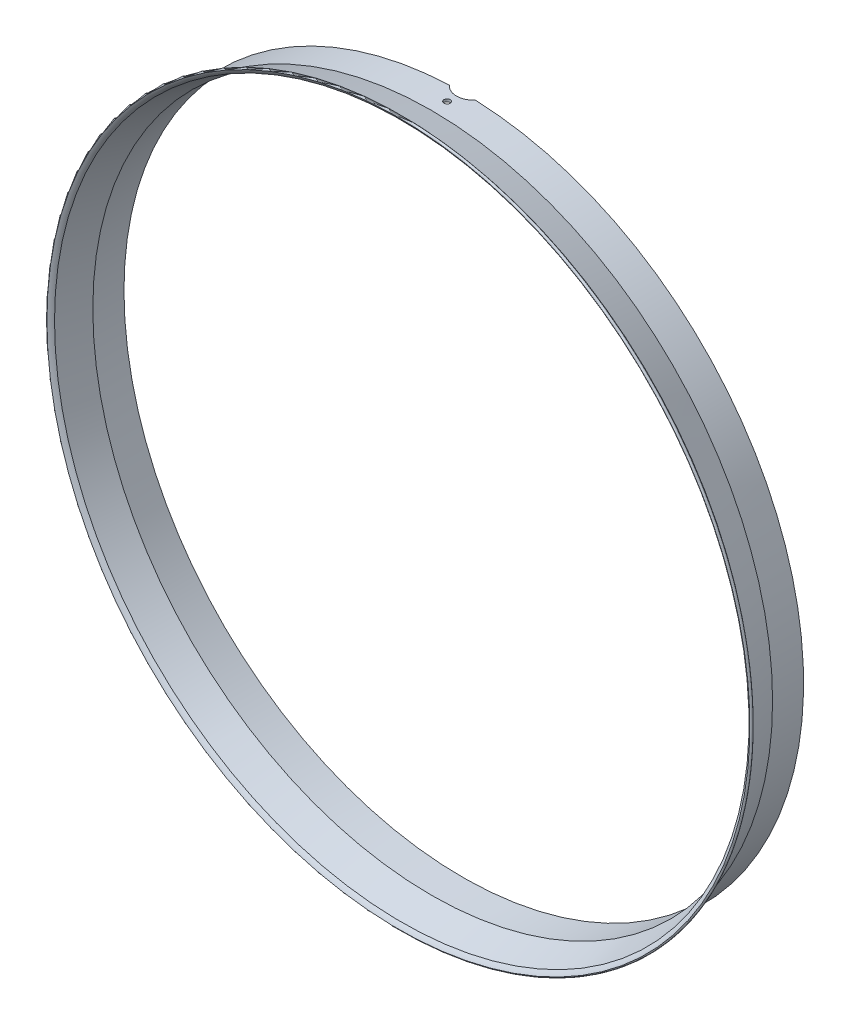
ISO-10303-21;
HEADER;
FILE_DESCRIPTION(('STEP AP214'),'2;1');
FILE_NAME('part.step','',(''),(''),'','','');
FILE_SCHEMA(('AUTOMOTIVE_DESIGN { 1 0 10303 214 1 1 1 1 }'));
ENDSEC;
DATA;
#1=APPLICATION_CONTEXT('core data for automotive mechanical design processes');
#2=APPLICATION_PROTOCOL_DEFINITION('international standard','automotive_design',2000,#1);
#3=PRODUCT_CONTEXT('',#1,'mechanical');
#4=PRODUCT('Part','Part','',(#3));
#5=PRODUCT_RELATED_PRODUCT_CATEGORY('part','',(#4));
#6=PRODUCT_DEFINITION_FORMATION('','',#4);
#7=PRODUCT_DEFINITION_CONTEXT('part definition',#1,'design');
#8=PRODUCT_DEFINITION('design','',#6,#7);
#9=PRODUCT_DEFINITION_SHAPE('','',#8);
#10=(LENGTH_UNIT() NAMED_UNIT(*) SI_UNIT(.MILLI.,.METRE.));
#11=(NAMED_UNIT(*) PLANE_ANGLE_UNIT() SI_UNIT($,.RADIAN.));
#12=(NAMED_UNIT(*) SI_UNIT($,.STERADIAN.) SOLID_ANGLE_UNIT());
#13=UNCERTAINTY_MEASURE_WITH_UNIT(LENGTH_MEASURE(1.E-05),#10,'distance_accuracy_value','');
#14=(GEOMETRIC_REPRESENTATION_CONTEXT(3) GLOBAL_UNCERTAINTY_ASSIGNED_CONTEXT((#13)) GLOBAL_UNIT_ASSIGNED_CONTEXT((#10,
#11,#12)) REPRESENTATION_CONTEXT('',''));
#15=CARTESIAN_POINT('',(0.,0.,0.));
#16=DIRECTION('',(0.,0.,1.));
#17=DIRECTION('',(1.,0.,0.));
#18=AXIS2_PLACEMENT_3D('',#15,#16,#17);
#19=CARTESIAN_POINT('',(-300.,798.285161389459,-417.264314324946));
#20=DIRECTION('',(0.,0.,-1.));
#21=DIRECTION('',(-1.,0.,0.));
#22=AXIS2_PLACEMENT_3D('',#19,#20,#21);
#23=CYLINDRICAL_SURFACE('',#22,163.7);
#24=CARTESIAN_POINT('',(-300.,798.285161389459,-438.785397410857));
#25=DIRECTION('',(0.,0.,-1.));
#26=DIRECTION('',(-1.,0.,0.));
#27=AXIS2_PLACEMENT_3D('',#24,#25,#26);
#28=CIRCLE('',#27,163.7);
#29=CARTESIAN_POINT('',(-463.7,798.285161389459,-438.785397410857));
#30=VERTEX_POINT('',#29);
#31=EDGE_CURVE('E91',#30,#30,#28,.T.);
#32=ORIENTED_EDGE('',*,*,#31,.T.);
#33=EDGE_LOOP('',(#32));
#34=FACE_BOUND('',#33,.T.);
#35=CARTESIAN_POINT('',(-300.,961.985161389459,-447.736353344203));
#36=CARTESIAN_POINT('',(-299.915746239032,961.98516129655,-447.736349608575));
#37=CARTESIAN_POINT('',(-299.831431431172,961.985095644998,-447.729230827914));
#38=CARTESIAN_POINT('',(-299.665124019418,961.984840059218,-447.700931458533));
#39=CARTESIAN_POINT('',(-299.583134332505,961.984649975505,-447.679733956266));
#40=CARTESIAN_POINT('',(-299.42391059771,961.984167058089,-447.623880755037));
#41=CARTESIAN_POINT('',(-299.346674293677,961.983874273581,-447.5892314988));
#42=CARTESIAN_POINT('',(-299.199136683253,961.983219006027,-447.507467240859));
#43=CARTESIAN_POINT('',(-299.128833661293,961.982856540289,-447.460355333586));
#44=CARTESIAN_POINT('',(-298.99712413169,961.982102672716,-447.354992131024));
#45=CARTESIAN_POINT('',(-298.9357187895,961.9817112671,-447.296739378778));
#46=CARTESIAN_POINT('',(-298.823557059873,961.980943668957,-447.170749322985));
#47=CARTESIAN_POINT('',(-298.772801091181,961.980567477029,-447.103011646656));
#48=CARTESIAN_POINT('',(-298.683381792881,961.979872737465,-446.959976300101));
#49=CARTESIAN_POINT('',(-298.644718450615,961.979554189768,-446.88467863779));
#50=CARTESIAN_POINT('',(-298.580582131524,961.979010655276,-446.728660831365));
#51=CARTESIAN_POINT('',(-298.555109125719,961.978785668277,-446.647940699166));
#52=CARTESIAN_POINT('',(-298.518077115924,961.97845462755,-446.483371503866));
#53=CARTESIAN_POINT('',(-298.506517742302,961.978348570665,-446.399522523949));
#54=CARTESIAN_POINT('',(-298.497640011791,961.978267338019,-446.231074118656));
#55=CARTESIAN_POINT('',(-298.500321626332,961.978292161996,-446.146474694787));
#56=CARTESIAN_POINT('',(-298.519849364364,961.978469888733,-445.978929423353));
#57=CARTESIAN_POINT('',(-298.536695067498,961.978622787693,-445.895983526792));
#58=CARTESIAN_POINT('',(-298.584072156505,961.979039420579,-445.734097134469));
#59=CARTESIAN_POINT('',(-298.614603558291,961.979303154635,-445.655156643366));
#60=CARTESIAN_POINT('',(-298.688485831099,961.979911728395,-445.503520685253));
#61=CARTESIAN_POINT('',(-298.731836893774,961.980256569312,-445.430825311628));
#62=CARTESIAN_POINT('',(-298.83012772119,961.98098847757,-445.293744236472));
#63=CARTESIAN_POINT('',(-298.885067484151,961.981375544903,-445.229358533663));
#64=CARTESIAN_POINT('',(-299.004978562779,961.982148284854,-445.11072199999));
#65=CARTESIAN_POINT('',(-299.069950248474,961.98253395742,-445.056471543127));
#66=CARTESIAN_POINT('',(-299.20807952216,961.983260412863,-444.959648381254));
#67=CARTESIAN_POINT('',(-299.281237111242,961.983601195734,-444.917075677799));
#68=CARTESIAN_POINT('',(-299.433661660063,961.984199451954,-444.844816588333));
#69=CARTESIAN_POINT('',(-299.512928624817,961.984456925234,-444.815130212899));
#70=CARTESIAN_POINT('',(-299.675321681688,961.984859533316,-444.76948672013));
#71=CARTESIAN_POINT('',(-299.758447772667,961.985004668152,-444.75352959875));
#72=CARTESIAN_POINT('',(-299.926196144556,961.98516623312,-444.735798042155));
#73=CARTESIAN_POINT('',(-300.010818370931,961.985182667934,-444.734023091064));
#74=CARTESIAN_POINT('',(-300.17915969105,961.985084992371,-444.744704917396));
#75=CARTESIAN_POINT('',(-300.262878784855,961.984970882003,-444.757161693864));
#76=CARTESIAN_POINT('',(-300.427035871471,961.984624983717,-444.795952939649));
#77=CARTESIAN_POINT('',(-300.507473919352,961.984393197775,-444.822287175939));
#78=CARTESIAN_POINT('',(-300.662787198909,961.983838079222,-444.888085550925));
#79=CARTESIAN_POINT('',(-300.737662430198,961.983514746605,-444.927549690538));
#80=CARTESIAN_POINT('',(-300.879726973421,961.982812973603,-445.018488931605));
#81=CARTESIAN_POINT('',(-300.946916063592,961.982434531629,-445.069964379486));
#82=CARTESIAN_POINT('',(-301.071698827272,961.981665210027,-445.183464515947));
#83=CARTESIAN_POINT('',(-301.129292494978,961.981274330393,-445.245489210907));
#84=CARTESIAN_POINT('',(-301.233251203452,961.980524188614,-445.378329359462));
#85=CARTESIAN_POINT('',(-301.279615908568,961.980164927415,-445.44914507574));
#86=CARTESIAN_POINT('',(-301.359798204267,961.97951854172,-445.597555602521));
#87=CARTESIAN_POINT('',(-301.393615809502,961.97923141714,-445.675150405107));
#88=CARTESIAN_POINT('',(-301.44774339544,961.978761682253,-445.834915193123));
#89=CARTESIAN_POINT('',(-301.468053597334,961.978579070233,-445.917085103609));
#90=CARTESIAN_POINT('',(-301.494590581575,961.978338943553,-446.08366875964));
#91=CARTESIAN_POINT('',(-301.500817342062,961.978281429087,-446.168082508669));
#92=CARTESIAN_POINT('',(-301.499010598977,961.978297983068,-446.336753981705));
#93=CARTESIAN_POINT('',(-301.490977644337,961.978372046451,-446.421011711593));
#94=CARTESIAN_POINT('',(-301.460880585984,961.978643395741,-446.586982738755));
#95=CARTESIAN_POINT('',(-301.438816454087,961.978840681897,-446.668696030917));
#96=CARTESIAN_POINT('',(-301.381282983554,961.979336238193,-446.82725997306));
#97=CARTESIAN_POINT('',(-301.345813396291,961.979634510207,-446.904110532822));
#98=CARTESIAN_POINT('',(-301.262477432632,961.980298395489,-447.050763133956));
#99=CARTESIAN_POINT('',(-301.214611539407,961.980664006132,-447.120565449901));
#100=CARTESIAN_POINT('',(-301.10784535244,961.9814213356,-447.251139391607));
#101=CARTESIAN_POINT('',(-301.048945809173,961.981813052648,-447.311911631063));
#102=CARTESIAN_POINT('',(-300.921762815714,961.982578560009,-447.422720678501));
#103=CARTESIAN_POINT('',(-300.853477037622,961.982952345844,-447.472754815393));
#104=CARTESIAN_POINT('',(-300.709446708512,961.983639912984,-447.560668446294));
#105=CARTESIAN_POINT('',(-300.633698494459,961.983953664597,-447.598541931849));
#106=CARTESIAN_POINT('',(-300.476977799739,961.984485172175,-447.660990585028));
#107=CARTESIAN_POINT('',(-300.396011709943,961.984703043106,-447.685581687057));
#108=CARTESIAN_POINT('',(-300.262108366615,961.984959705225,-447.714216915636));
#109=CARTESIAN_POINT('',(-300.21004110252,961.985035010787,-447.722507708423));
#110=CARTESIAN_POINT('',(-300.105323845692,961.985135881946,-447.733577090353));
#111=CARTESIAN_POINT('',(-300.052673852975,961.985161447543,-447.736355679646));
#112=CARTESIAN_POINT('',(-300.,961.985161389459,-447.736353344203));
#113=B_SPLINE_CURVE_WITH_KNOTS('',3,(#35,#36,#37,#38,#39,#40,#41,#42,#43,#44,#45,#46,#47,#48,
#49,#50,#51,#52,#53,#54,#55,#56,#57,#58,#59,#60,#61,#62,#63,#64,#65,#66,#67,#68,#69,#70,#71,#72,
#73,#74,#75,#76,#77,#78,#79,#80,#81,#82,#83,#84,#85,#86,#87,#88,#89,#90,#91,#92,#93,#94,#95,#96,
#97,#98,#99,#100,#101,#102,#103,#104,#105,#106,#107,#108,#109,#110,#111,#112),.UNSPECIFIED.,.T.,
.F.,(4,2,2,2,2,2,2,2,2,2,2,2,2,2,2,2,2,2,2,2,2,2,2,2,2,2,2,2,2,2,2,2,2,2,2,2,2,2,4),(0.,
0.252569022833617,0.505442020986967,0.758194054596072,1.01088338959392,1.26360579297818,
1.51633813182713,1.76907020611721,2.02180172511487,2.27452652986421,2.52725082760481,
2.77996762533772,3.0326847169162,3.28540558677774,3.53812641779074,3.79085657263411,
4.04358676112632,4.2963171570277,4.54904747844556,4.80176860674567,5.05448971808207,
5.30720658589651,5.55992347133885,5.81264764645979,6.06537197442477,6.3181038558041,
6.57083544204778,6.8235628895896,7.07629072942587,7.32900884065147,7.58172745950137,
7.83445076569585,8.08716422299113,8.33986049771636,8.59261955765358,8.84550331178826,
9.0980830126019,9.25598437842631,9.4138857400037),.UNSPECIFIED.);
#114=CARTESIAN_POINT('',(-300.,961.985161389459,-447.736353344203));
#115=VERTEX_POINT('',#114);
#116=EDGE_CURVE('E87',#115,#115,#113,.T.);
#117=ORIENTED_EDGE('',*,*,#116,.T.);
#118=EDGE_LOOP('',(#117));
#119=FACE_BOUND('',#118,.T.);
#120=CARTESIAN_POINT('',(-300.,798.285161389459,-453.670006408865));
#121=DIRECTION('',(0.,0.,-1.));
#122=DIRECTION('',(-1.,0.,0.));
#123=AXIS2_PLACEMENT_3D('',#120,#121,#122);
#124=CIRCLE('',#123,163.7);
#125=CARTESIAN_POINT('',(-293.808705407526,961.868039073125,-453.670006408865));
#126=VERTEX_POINT('',#125);
#127=CARTESIAN_POINT('',(-306.191294592474,961.868039073125,-453.670006408865));
#128=VERTEX_POINT('',#127);
#129=EDGE_CURVE('E84',#126,#128,#124,.T.);
#130=ORIENTED_EDGE('',*,*,#129,.F.);
#131=CARTESIAN_POINT('',(-293.808705407526,961.868039073125,-453.670006408865));
#132=CARTESIAN_POINT('',(-293.951181950129,961.873432031995,-453.495856092082));
#133=CARTESIAN_POINT('',(-294.101037717412,961.878916977127,-453.327751591163));
#134=CARTESIAN_POINT('',(-294.414360592834,961.889914239846,-453.004761021858));
#135=CARTESIAN_POINT('',(-294.577827078942,961.895426556172,-452.84987435005));
#136=CARTESIAN_POINT('',(-294.917126763392,961.906318927281,-452.554526524742));
#137=CARTESIAN_POINT('',(-295.092951822011,961.911699066025,-452.414056023577));
#138=CARTESIAN_POINT('',(-295.455809708453,961.922178193678,-452.148418622291));
#139=CARTESIAN_POINT('',(-295.642842395598,961.927277186114,-452.023251530142));
#140=CARTESIAN_POINT('',(-296.026883970234,961.937051864202,-451.789054681234));
#141=CARTESIAN_POINT('',(-296.223897516728,961.941727349271,-451.680032555754));
#142=CARTESIAN_POINT('',(-296.626423679728,961.950519677028,-451.478971152425));
#143=CARTESIAN_POINT('',(-296.831936425396,961.954636511221,-451.386932132786));
#144=CARTESIAN_POINT('',(-297.249954177638,961.962193781889,-451.220513671002));
#145=CARTESIAN_POINT('',(-297.462457714324,961.965634359505,-451.146130543203));
#146=CARTESIAN_POINT('',(-297.892985652767,961.971742494321,-451.015531318551));
#147=CARTESIAN_POINT('',(-298.11101002564,961.974410055563,-450.959315126678));
#148=CARTESIAN_POINT('',(-298.550861145344,961.978894712268,-450.865487678137));
#149=CARTESIAN_POINT('',(-298.772684874258,961.980712452992,-450.827862304414));
#150=CARTESIAN_POINT('',(-299.218791014881,961.983449349967,-450.771412779533));
#151=CARTESIAN_POINT('',(-299.443074204685,961.984368213033,-450.752594762703));
#152=CARTESIAN_POINT('',(-299.892412153057,961.985280193809,-450.733917205895));
#153=CARTESIAN_POINT('',(-300.117466847343,961.985273386857,-450.734056123069));
#154=CARTESIAN_POINT('',(-300.56676300201,961.984334408863,-450.753287588124));
#155=CARTESIAN_POINT('',(-300.791004462569,961.983402238025,-450.772380131847));
#156=CARTESIAN_POINT('',(-301.236883710133,961.980640195978,-450.829357159674));
#157=CARTESIAN_POINT('',(-301.458523585711,961.978811103672,-450.867225338959));
#158=CARTESIAN_POINT('',(-301.897751098823,961.974308138721,-450.961459480141));
#159=CARTESIAN_POINT('',(-302.115340031874,961.971634541244,-451.017819417019));
#160=CARTESIAN_POINT('',(-302.545104349684,961.965516517792,-451.148670946663));
#161=CARTESIAN_POINT('',(-302.757276957155,961.962071704874,-451.22317164289));
#162=CARTESIAN_POINT('',(-303.174582986803,961.954509701823,-451.389755854513));
#163=CARTESIAN_POINT('',(-303.37971664084,961.950392533863,-451.481838790097));
#164=CARTESIAN_POINT('',(-303.781743724403,961.941596936266,-451.683055853328));
#165=CARTESIAN_POINT('',(-303.978626790521,961.936917827702,-451.792210656022));
#166=CARTESIAN_POINT('',(-304.362486775897,961.927135145479,-452.026711777742));
#167=CARTESIAN_POINT('',(-304.549463924678,961.922031581661,-452.152057721382));
#168=CARTESIAN_POINT('',(-304.911918624329,961.911552565088,-452.417849257392));
#169=CARTESIAN_POINT('',(-305.087412627234,961.90617752177,-452.558272450689));
#170=CARTESIAN_POINT('',(-305.425892921429,961.895302707736,-452.853322909396));
#171=CARTESIAN_POINT('',(-305.588885906224,961.889803005838,-453.007942474714));
#172=CARTESIAN_POINT('',(-305.822950529212,961.881583507103,-453.249479231798));
#173=CARTESIAN_POINT('',(-305.899147592611,961.878852011532,-453.331486386511));
#174=CARTESIAN_POINT('',(-306.047925856804,961.873419285427,-453.498502790316));
#175=CARTESIAN_POINT('',(-306.120512195554,961.870718016389,-453.583507461269));
#176=CARTESIAN_POINT('',(-306.191294592474,961.868039073125,-453.670006408865));
#177=B_SPLINE_CURVE_WITH_KNOTS('',3,(#131,#132,#133,#134,#135,#136,#137,#138,#139,#140,#141,
#142,#143,#144,#145,#146,#147,#148,#149,#150,#151,#152,#153,#154,#155,#156,#157,#158,#159,#160,
#161,#162,#163,#164,#165,#166,#167,#168,#169,#170,#171,#172,#173,#174,#175,#176),.UNSPECIFIED.,
.F.,.F.,(4,2,2,2,2,2,2,2,2,2,2,2,2,2,2,2,2,2,2,2,2,2,4),(0.,0.675007166654227,1.34998350132435,
2.02451936849413,2.69904677069853,3.37389199258843,4.04874747393007,4.72346195560758,
5.39817290820455,6.07237072434966,6.7467883694763,7.42115112575223,8.09551373409425,
8.76929174695911,9.4428504458507,10.1167478515277,10.790623037814,11.4653207382557,
12.1400027989251,12.8136960548688,13.4870260352105,13.822869073856,14.1582196812711),.UNSPECIFIED.);
#178=EDGE_CURVE('E69',#126,#128,#177,.T.);
#179=ORIENTED_EDGE('',*,*,#178,.T.);
#180=EDGE_LOOP('',(#130,#179));
#181=FACE_BOUND('',#180,.T.);
#182=ADVANCED_FACE('F43',(#34,#119,#181),#23,.T.);
#183=CARTESIAN_POINT('',(-300.,635.785161389459,-453.670006408865));
#184=DIRECTION('',(0.,0.,-1.));
#185=DIRECTION('',(-1.,0.,0.));
#186=AXIS2_PLACEMENT_3D('',#183,#184,#185);
#187=PLANE('',#186);
#188=CARTESIAN_POINT('',(-300.,798.285161389459,-453.670006408865));
#189=DIRECTION('',(0.,0.,-1.));
#190=DIRECTION('',(-1.,0.,0.));
#191=AXIS2_PLACEMENT_3D('',#188,#189,#190);
#192=CIRCLE('',#191,162.5);
#193=CARTESIAN_POINT('',(-293.808705407526,960.667173543728,-453.670006408865));
#194=VERTEX_POINT('',#193);
#195=CARTESIAN_POINT('',(-306.191294592474,960.667173543728,-453.670006408865));
#196=VERTEX_POINT('',#195);
#197=EDGE_CURVE('E92',#194,#196,#192,.T.);
#198=ORIENTED_EDGE('',*,*,#197,.F.);
#199=DIRECTION('',(0.,-1.,0.));
#200=VECTOR('',#199,1.);
#201=CARTESIAN_POINT('',(-293.808705407526,967.58739754846,-453.670006408865));
#202=LINE('',#201,#200);
#203=EDGE_CURVE('E65',#126,#194,#202,.T.);
#204=ORIENTED_EDGE('',*,*,#203,.F.);
#205=ORIENTED_EDGE('',*,*,#129,.T.);
#206=DIRECTION('',(0.,-1.,0.));
#207=VECTOR('',#206,1.);
#208=CARTESIAN_POINT('',(-306.191294592474,967.58739754846,-453.670006408865));
#209=LINE('',#208,#207);
#210=EDGE_CURVE('E74',#128,#196,#209,.T.);
#211=ORIENTED_EDGE('',*,*,#210,.T.);
#212=EDGE_LOOP('',(#198,#204,#205,#211));
#213=FACE_BOUND('',#212,.T.);
#214=ADVANCED_FACE('F89',(#213),#187,.T.);
#215=CARTESIAN_POINT('',(-300.,798.285161389459,-417.264314324946));
#216=DIRECTION('',(0.,0.,-1.));
#217=DIRECTION('',(-1.,0.,0.));
#218=AXIS2_PLACEMENT_3D('',#215,#216,#217);
#219=CYLINDRICAL_SURFACE('',#218,162.5);
#220=CARTESIAN_POINT('',(-300.,798.285161389459,-438.713521565126));
#221=DIRECTION('',(0.,0.,-1.));
#222=DIRECTION('',(-1.,0.,0.));
#223=AXIS2_PLACEMENT_3D('',#220,#221,#222);
#224=CIRCLE('',#223,162.5);
#225=CARTESIAN_POINT('',(-462.5,798.285161389459,-438.713521565126));
#226=VERTEX_POINT('',#225);
#227=EDGE_CURVE('E99',#226,#226,#224,.T.);
#228=ORIENTED_EDGE('',*,*,#227,.F.);
#229=EDGE_LOOP('',(#228));
#230=FACE_BOUND('',#229,.T.);
#231=CARTESIAN_POINT('',(-300.,960.785161389459,-447.736353344203));
#232=CARTESIAN_POINT('',(-300.084253732841,960.785161295865,-447.736349608585));
#233=CARTESIAN_POINT('',(-300.168568511886,960.785095159546,-447.729230832658));
#234=CARTESIAN_POINT('',(-300.334875864874,960.784837686536,-447.700931483179));
#235=CARTESIAN_POINT('',(-300.416865521867,960.78464619926,-447.679733996269));
#236=CARTESIAN_POINT('',(-300.576089196671,960.784159716006,-447.623880838235));
#237=CARTESIAN_POINT('',(-300.653325470706,960.783864769589,-447.589231610044));
#238=CARTESIAN_POINT('',(-300.800863027088,960.78320466352,-447.507467420717));
#239=CARTESIAN_POINT('',(-300.871166024959,960.782839521303,-447.46035555393));
#240=CARTESIAN_POINT('',(-301.002875542856,960.78208008686,-447.354992422023));
#241=CARTESIAN_POINT('',(-301.064280893969,960.781685790814,-447.296739695619));
#242=CARTESIAN_POINT('',(-301.176442647896,960.780912524028,-447.170749689962));
#243=CARTESIAN_POINT('',(-301.227198631957,960.780533553892,-447.103012037919));
#244=CARTESIAN_POINT('',(-301.316617979581,960.779833683386,-446.959976715675));
#245=CARTESIAN_POINT('',(-301.355281352651,960.77951278297,-446.884679051419));
#246=CARTESIAN_POINT('',(-301.419417730996,960.778965233955,-446.728661230744));
#247=CARTESIAN_POINT('',(-301.444890765289,960.778738585147,-446.647941086255));
#248=CARTESIAN_POINT('',(-301.481922818509,960.778405099243,-446.483371892511));
#249=CARTESIAN_POINT('',(-301.493482212938,960.778298258913,-446.399522927761));
#250=CARTESIAN_POINT('',(-301.502359989047,960.778216425925,-446.231074548232));
#251=CARTESIAN_POINT('',(-301.499678399338,960.778241433002,-446.146475134963));
#252=CARTESIAN_POINT('',(-301.480150719104,960.77842047177,-445.978929919567));
#253=CARTESIAN_POINT('',(-301.463305055247,960.778574499573,-445.895984067707));
#254=CARTESIAN_POINT('',(-301.415928061586,960.778994208579,-445.734097758178));
#255=CARTESIAN_POINT('',(-301.385396715847,960.779259889911,-445.655157305173));
#256=CARTESIAN_POINT('',(-301.31151456304,960.779872957221,-445.503521395016));
#257=CARTESIAN_POINT('',(-301.268163561415,960.780220344439,-445.430826032663));
#258=CARTESIAN_POINT('',(-301.169872864362,960.780957657197,-445.293744966906));
#259=CARTESIAN_POINT('',(-301.114933170673,960.781347582731,-445.229359262256));
#260=CARTESIAN_POINT('',(-300.995022201166,960.782126029136,-445.110722675083));
#261=CARTESIAN_POINT('',(-300.930050549856,960.782514549954,-445.056472172083));
#262=CARTESIAN_POINT('',(-300.791921333801,960.78324637054,-444.959648911892));
#263=CARTESIAN_POINT('',(-300.718763767965,960.7835896703,-444.917076156255));
#264=CARTESIAN_POINT('',(-300.566339250749,960.784192345195,-444.844816958462));
#265=CARTESIAN_POINT('',(-300.487072294276,960.78445172026,-444.815130527047));
#266=CARTESIAN_POINT('',(-300.324679240131,960.78485730238,-444.769486923404));
#267=CARTESIAN_POINT('',(-300.241553143609,960.785003509468,-444.75352974708));
#268=CARTESIAN_POINT('',(-300.073804794916,960.785166268445,-444.735798089986));
#269=CARTESIAN_POINT('',(-299.989182598087,960.785182825119,-444.734023085693));
#270=CARTESIAN_POINT('',(-299.820841328261,960.785084429319,-444.744704796602));
#271=CARTESIAN_POINT('',(-299.737122255201,960.784969476853,-444.757161510826));
#272=CARTESIAN_POINT('',(-299.572965221877,960.78462102541,-444.795952618554));
#273=CARTESIAN_POINT('',(-299.492527205723,960.784387528453,-444.822286775565));
#274=CARTESIAN_POINT('',(-299.337213975334,960.783828311786,-444.888084977195));
#275=CARTESIAN_POINT('',(-299.262338761503,960.783502592069,-444.927549022767));
#276=CARTESIAN_POINT('',(-299.120274203106,960.782795637588,-445.01848808341));
#277=CARTESIAN_POINT('',(-299.053085083605,960.782414401199,-445.069963450066));
#278=CARTESIAN_POINT('',(-298.928302245124,960.781639398623,-445.183463426467));
#279=CARTESIAN_POINT('',(-298.870708531974,960.781245632428,-445.245488042624));
#280=CARTESIAN_POINT('',(-298.766749692235,960.780489950517,-445.378328070964));
#281=CARTESIAN_POINT('',(-298.720384906219,960.780128035767,-445.449143749683));
#282=CARTESIAN_POINT('',(-298.640202444174,960.779476875459,-445.597554220271));
#283=CARTESIAN_POINT('',(-298.606384753471,960.779187629816,-445.675149004212));
#284=CARTESIAN_POINT('',(-298.552257003188,960.778714424575,-445.834913755733));
#285=CARTESIAN_POINT('',(-298.531946719215,960.778530463228,-445.917083647284));
#286=CARTESIAN_POINT('',(-298.505409569249,960.778288561686,-446.083667282076));
#287=CARTESIAN_POINT('',(-298.499182725066,960.778230621686,-446.168081028791));
#288=CARTESIAN_POINT('',(-298.500989301803,960.778247296387,-446.336752465074));
#289=CARTESIAN_POINT('',(-298.509022166056,960.778321905913,-446.421010160605));
#290=CARTESIAN_POINT('',(-298.539119031304,960.778595257478,-446.586981133666));
#291=CARTESIAN_POINT('',(-298.561183060482,960.778793999765,-446.668694406086));
#292=CARTESIAN_POINT('',(-298.618716314452,960.77929321416,-446.827258325314));
#293=CARTESIAN_POINT('',(-298.654185787855,960.779593688154,-446.904108881909));
#294=CARTESIAN_POINT('',(-298.737521515327,960.780262474872,-447.050761497776));
#295=CARTESIAN_POINT('',(-298.78538728628,960.780630784952,-447.120563831588));
#296=CARTESIAN_POINT('',(-298.892153254558,960.781393706581,-447.251137870115));
#297=CARTESIAN_POINT('',(-298.951052707402,960.781788316355,-447.311910183621));
#298=CARTESIAN_POINT('',(-299.078235533576,960.782559477113,-447.422719395317));
#299=CARTESIAN_POINT('',(-299.146521234797,960.782936023586,-447.472753622435));
#300=CARTESIAN_POINT('',(-299.290551446309,960.783628669287,-447.560667458629));
#301=CARTESIAN_POINT('',(-299.366299621386,960.783944738589,-447.598541056399));
#302=CARTESIAN_POINT('',(-299.523020263376,960.784480172855,-447.660989937617));
#303=CARTESIAN_POINT('',(-299.603986339434,960.784699653632,-447.685581155349));
#304=CARTESIAN_POINT('',(-299.737889991151,960.784958213312,-447.714216636212));
#305=CARTESIAN_POINT('',(-299.789957576627,960.785034075927,-447.722507533535));
#306=CARTESIAN_POINT('',(-299.894675487976,960.785135693256,-447.733577055181));
#307=CARTESIAN_POINT('',(-299.947325813834,960.785161447972,-447.736355679656));
#308=CARTESIAN_POINT('',(-300.,960.785161389459,-447.736353344203));
#309=B_SPLINE_CURVE_WITH_KNOTS('',3,(#231,#232,#233,#234,#235,#236,#237,#238,#239,#240,#241,
#242,#243,#244,#245,#246,#247,#248,#249,#250,#251,#252,#253,#254,#255,#256,#257,#258,#259,#260,
#261,#262,#263,#264,#265,#266,#267,#268,#269,#270,#271,#272,#273,#274,#275,#276,#277,#278,#279,
#280,#281,#282,#283,#284,#285,#286,#287,#288,#289,#290,#291,#292,#293,#294,#295,#296,#297,#298,
#299,#300,#301,#302,#303,#304,#305,#306,#307,#308),.UNSPECIFIED.,.T.,.F.,(4,2,2,2,2,2,2,2,2,2,2,
2,2,2,2,2,2,2,2,2,2,2,2,2,2,2,2,2,2,2,2,2,2,2,2,2,2,2,4),(0.,0.252568937225629,
0.505441846470187,0.758193787175668,1.01088303088137,1.26360544118503,1.51633778714558,
1.76906993441603,2.0218015256959,2.27452629605979,2.52725055865014,2.77996720864466,
3.0326841528858,3.28540493262658,3.53812567445926,3.79085587782814,4.0435861148552,
4.29631656254593,4.54904693481762,4.8017679777031,5.05448900320452,5.30720572210265,
5.55992245937906,5.81264659487778,6.06537088396994,6.3181028372485,6.57083449497144,
6.82356195407627,7.07628980453983,7.32900778930507,7.58172628168597,7.83444946107801,
8.08716279266191,8.33985907893347,8.59261815008928,8.84550197476826,9.09808174827133,
9.25598411216266,9.41388647174382),.UNSPECIFIED.);
#310=CARTESIAN_POINT('',(-300.,960.785161389459,-447.736353344203));
#311=VERTEX_POINT('',#310);
#312=EDGE_CURVE('E108',#311,#311,#309,.T.);
#313=ORIENTED_EDGE('',*,*,#312,.T.);
#314=EDGE_LOOP('',(#313));
#315=FACE_BOUND('',#314,.T.);
#316=ORIENTED_EDGE('',*,*,#197,.T.);
#317=CARTESIAN_POINT('',(-306.191294592474,960.667173543728,-453.670006408865));
#318=CARTESIAN_POINT('',(-306.048818002434,960.672606387103,-453.495856039535));
#319=CARTESIAN_POINT('',(-305.898962209217,960.678131891902,-453.327751511149));
#320=CARTESIAN_POINT('',(-305.585639278756,960.68921046805,-453.004760893853));
#321=CARTESIAN_POINT('',(-305.4221727631,960.69476353813,-452.84987420195));
#322=CARTESIAN_POINT('',(-305.082872872858,960.705736435265,-452.554526218712));
#323=CARTESIAN_POINT('',(-304.907047630177,960.711156346825,-452.414055588736));
#324=CARTESIAN_POINT('',(-304.544189272316,960.721712936024,-452.148417909941));
#325=CARTESIAN_POINT('',(-304.357156297881,960.726849617217,-452.023250669004));
#326=CARTESIAN_POINT('',(-303.973113954118,960.736696540599,-451.789053479885));
#327=CARTESIAN_POINT('',(-303.776099923366,960.741406580619,-451.680031166824));
#328=CARTESIAN_POINT('',(-303.373572610012,960.750263885193,-451.478969409415));
#329=CARTESIAN_POINT('',(-303.16805919835,960.754411141196,-451.386930223065));
#330=CARTESIAN_POINT('',(-302.750039965672,960.762024251579,-451.220511506821));
#331=CARTESIAN_POINT('',(-302.537535616101,960.765490248292,-451.146128287456));
#332=CARTESIAN_POINT('',(-302.107005877108,960.771643504174,-451.015528981728));
#333=CARTESIAN_POINT('',(-301.888980516621,960.774330767424,-450.959312800175));
#334=CARTESIAN_POINT('',(-301.449129417401,960.778848516419,-450.865485973806));
#335=CARTESIAN_POINT('',(-301.227306735057,960.78067966046,-450.827861032338));
#336=CARTESIAN_POINT('',(-300.781202645415,960.783436736232,-450.771412187726));
#337=CARTESIAN_POINT('',(-300.556920460006,960.784362372613,-450.752594418856));
#338=CARTESIAN_POINT('',(-300.107584517008,960.785281071957,-450.733917189548));
#339=CARTESIAN_POINT('',(-299.882530823725,960.785274210843,-450.734056185668));
#340=CARTESIAN_POINT('',(-299.433236695768,960.78432829945,-450.753287638147));
#341=CARTESIAN_POINT('',(-299.208996260912,960.783389249378,-450.7723800903));
#342=CARTESIAN_POINT('',(-298.763121847297,960.780606844987,-450.829356398655));
#343=CARTESIAN_POINT('',(-298.541485750488,960.778764286371,-450.867223720486));
#344=CARTESIAN_POINT('',(-298.102265747416,960.77422817817,-450.961455481447));
#345=CARTESIAN_POINT('',(-297.884680545655,960.771534905775,-451.017813895797));
#346=CARTESIAN_POINT('',(-297.454923587263,960.765371863527,-451.148661696257));
#347=CARTESIAN_POINT('',(-297.242754607833,960.761901703889,-451.223160185378));
#348=CARTESIAN_POINT('',(-296.82545564217,960.754284058944,-451.389739291562));
#349=CARTESIAN_POINT('',(-296.620325424167,960.750136595965,-451.481819329047));
#350=CARTESIAN_POINT('',(-296.218303520731,960.741276241273,-451.683030612471));
#351=CARTESIAN_POINT('',(-296.021422257615,960.736562661718,-451.792182650868));
#352=CARTESIAN_POINT('',(-295.637565611451,960.726707896364,-452.026677816352));
#353=CARTESIAN_POINT('',(-295.450589999036,960.721566720473,-452.15202056831));
#354=CARTESIAN_POINT('',(-295.08813797398,960.711010456334,-452.417805367453));
#355=CARTESIAN_POINT('',(-294.912645111911,960.705595780518,-452.558225018953));
#356=CARTESIAN_POINT('',(-294.57416664476,960.694640757849,-452.853268090628));
#357=CARTESIAN_POINT('',(-294.411174346974,960.689100480331,-453.007883811523));
#358=CARTESIAN_POINT('',(-294.17709914442,960.680819921372,-453.249426219501));
#359=CARTESIAN_POINT('',(-294.100891506651,960.678067867155,-453.33144341084));
#360=CARTESIAN_POINT('',(-293.952093005689,960.672594250532,-453.49848070088));
#361=CARTESIAN_POINT('',(-293.87949700282,960.669872649331,-453.58349621984));
#362=CARTESIAN_POINT('',(-293.808705407526,960.667173543728,-453.670006408865));
#363=B_SPLINE_CURVE_WITH_KNOTS('',3,(#317,#318,#319,#320,#321,#322,#323,#324,#325,#326,#327,
#328,#329,#330,#331,#332,#333,#334,#335,#336,#337,#338,#339,#340,#341,#342,#343,#344,#345,#346,
#347,#348,#349,#350,#351,#352,#353,#354,#355,#356,#357,#358,#359,#360,#361,#362),.UNSPECIFIED.,
.F.,.F.,(4,2,2,2,2,2,2,2,2,2,2,2,2,2,2,2,2,2,2,2,2,2,4),(0.,0.675010256701283,1.34998970317734,
2.0245291047643,2.6990600373982,3.37390895169869,4.04876811705579,4.72348613628933,
5.39820062011569,6.07239543825389,6.74681008458187,7.42116982070372,8.095529407113,
8.76929616061998,9.44284360462653,10.1167297458207,10.790593676144,11.4652848082061,
12.1399603108814,12.813647143318,13.4869707339618,13.8228588840385,14.1582544968135),.UNSPECIFIED.);
#364=EDGE_CURVE('E11',#196,#194,#363,.T.);
#365=ORIENTED_EDGE('',*,*,#364,.T.);
#366=EDGE_LOOP('',(#316,#365));
#367=FACE_BOUND('',#366,.T.);
#368=ADVANCED_FACE('F115',(#230,#315,#367),#219,.F.);
#369=CARTESIAN_POINT('',(-300.,798.285161389459,-423.585289329693));
#370=DIRECTION('',(0.,0.,-1.));
#371=DIRECTION('',(-1.,0.,0.));
#372=AXIS2_PLACEMENT_3D('',#369,#370,#371);
#373=TOROIDAL_SURFACE('',#372,168.603734933989,0.698501225012029);
#374=CARTESIAN_POINT('',(-300.,798.285161389459,-422.895529537874));
#375=DIRECTION('',(0.,0.,-1.));
#376=DIRECTION('',(-1.,0.,0.));
#377=AXIS2_PLACEMENT_3D('',#374,#375,#376);
#378=CIRCLE('',#377,168.713895684405);
#379=CARTESIAN_POINT('',(-468.713895684405,798.285161389459,-422.895529537874));
#380=VERTEX_POINT('',#379);
#381=EDGE_CURVE('E86',#380,#380,#378,.T.);
#382=ORIENTED_EDGE('',*,*,#381,.T.);
#383=EDGE_LOOP('',(#382));
#384=FACE_BOUND('',#383,.T.);
#385=CARTESIAN_POINT('',(-300.,798.285161389459,-424.135247944229));
#386=DIRECTION('',(0.,0.,-1.));
#387=DIRECTION('',(-1.,0.,0.));
#388=AXIS2_PLACEMENT_3D('',#385,#386,#387);
#389=CIRCLE('',#388,169.034373394465);
#390=CARTESIAN_POINT('',(-469.034373394465,798.285161389459,-424.135247944229));
#391=VERTEX_POINT('',#390);
#392=EDGE_CURVE('E58',#391,#391,#389,.T.);
#393=ORIENTED_EDGE('',*,*,#392,.F.);
#394=EDGE_LOOP('',(#393));
#395=FACE_BOUND('',#394,.T.);
#396=ADVANCED_FACE('F45',(#384,#395),#373,.T.);
#397=CARTESIAN_POINT('',(-300.,798.285161389459,-428.301729869639));
#398=DIRECTION('',(0.,0.,-1.));
#399=DIRECTION('',(-1.,0.,0.));
#400=AXIS2_PLACEMENT_3D('',#397,#398,#399);
#401=TOROIDAL_SURFACE('',#400,171.424358314087,4.80329049202615);
#402=ORIENTED_EDGE('',*,*,#392,.T.);
#403=EDGE_LOOP('',(#402));
#404=FACE_BOUND('',#403,.T.);
#405=CARTESIAN_POINT('',(-300.,798.285161389459,-425.265443891235));
#406=DIRECTION('',(0.,0.,-1.));
#407=DIRECTION('',(-1.,0.,0.));
#408=AXIS2_PLACEMENT_3D('',#405,#406,#407);
#409=CIRCLE('',#408,167.702454633424);
#410=CARTESIAN_POINT('',(-467.702454633424,798.285161389459,-425.265443891235));
#411=VERTEX_POINT('',#410);
#412=EDGE_CURVE('E97',#411,#411,#409,.T.);
#413=ORIENTED_EDGE('',*,*,#412,.F.);
#414=EDGE_LOOP('',(#413));
#415=FACE_BOUND('',#414,.T.);
#416=ADVANCED_FACE('F148',(#404,#415),#401,.F.);
#417=CARTESIAN_POINT('',(-300.,798.285161389459,-438.785397410857));
#418=DIRECTION('',(0.,0.,1.));
#419=DIRECTION('',(1.,0.,0.));
#420=AXIS2_PLACEMENT_3D('',#417,#418,#419);
#421=CONICAL_SURFACE('',#420,163.7,0.287820335396948);
#422=ORIENTED_EDGE('',*,*,#412,.T.);
#423=EDGE_LOOP('',(#422));
#424=FACE_BOUND('',#423,.T.);
#425=ORIENTED_EDGE('',*,*,#31,.F.);
#426=EDGE_LOOP('',(#425));
#427=FACE_BOUND('',#426,.T.);
#428=ADVANCED_FACE('F144',(#424,#427),#421,.T.);
#429=CARTESIAN_POINT('',(-300.,798.285161389459,-424.52627649101));
#430=DIRECTION('',(0.,0.,1.));
#431=DIRECTION('',(1.,0.,0.));
#432=AXIS2_PLACEMENT_3D('',#429,#430,#431);
#433=CONICAL_SURFACE('',#432,166.7,0.287820335396953);
#434=ORIENTED_EDGE('',*,*,#227,.T.);
#435=EDGE_LOOP('',(#434));
#436=FACE_BOUND('',#435,.T.);
#437=CARTESIAN_POINT('',(-300.,798.285161389459,-424.52627649101));
#438=DIRECTION('',(0.,0.,-1.));
#439=DIRECTION('',(-1.,0.,0.));
#440=AXIS2_PLACEMENT_3D('',#437,#438,#439);
#441=CIRCLE('',#440,166.7);
#442=CARTESIAN_POINT('',(-466.7,798.285161389459,-424.52627649101));
#443=VERTEX_POINT('',#442);
#444=EDGE_CURVE('E176',#443,#443,#441,.T.);
#445=ORIENTED_EDGE('',*,*,#444,.F.);
#446=EDGE_LOOP('',(#445));
#447=FACE_BOUND('',#446,.T.);
#448=ADVANCED_FACE('F147',(#436,#447),#433,.F.);
#449=CARTESIAN_POINT('',(-300.,798.285161389459,-428.301729869639));
#450=DIRECTION('',(0.,0.,-1.));
#451=DIRECTION('',(-1.,0.,0.));
#452=AXIS2_PLACEMENT_3D('',#449,#450,#451);
#453=TOROIDAL_SURFACE('',#452,171.424358314087,6.04761190008798);
#454=ORIENTED_EDGE('',*,*,#444,.T.);
#455=EDGE_LOOP('',(#454));
#456=FACE_BOUND('',#455,.T.);
#457=ORIENTED_EDGE('',*,*,#381,.F.);
#458=EDGE_LOOP('',(#457));
#459=FACE_BOUND('',#458,.T.);
#460=ADVANCED_FACE('F123',(#456,#459),#453,.T.);
#461=CARTESIAN_POINT('',(-300.,967.58739754846,-446.236353344203));
#462=DIRECTION('',(0.,-1.,0.));
#463=DIRECTION('',(0.,0.,-1.));
#464=AXIS2_PLACEMENT_3D('',#461,#462,#463);
#465=CYLINDRICAL_SURFACE('',#464,1.50000000000002);
#466=ORIENTED_EDGE('',*,*,#116,.F.);
#467=EDGE_LOOP('',(#466));
#468=FACE_BOUND('',#467,.T.);
#469=ORIENTED_EDGE('',*,*,#312,.F.);
#470=EDGE_LOOP('',(#469));
#471=FACE_BOUND('',#470,.T.);
#472=ADVANCED_FACE('F119',(#468,#471),#465,.F.);
#473=CARTESIAN_POINT('',(-300.,967.58739754846,-458.736353344203));
#474=DIRECTION('',(0.,-1.,0.));
#475=DIRECTION('',(0.,0.,-1.));
#476=AXIS2_PLACEMENT_3D('',#473,#474,#475);
#477=CYLINDRICAL_SURFACE('',#476,8.00000000000002);
#478=ORIENTED_EDGE('',*,*,#203,.T.);
#479=ORIENTED_EDGE('',*,*,#364,.F.);
#480=ORIENTED_EDGE('',*,*,#210,.F.);
#481=ORIENTED_EDGE('',*,*,#178,.F.);
#482=EDGE_LOOP('',(#478,#479,#480,#481));
#483=FACE_BOUND('',#482,.T.);
#484=ADVANCED_FACE('F75',(#483),#477,.F.);
#485=CLOSED_SHELL('',(#182,#214,#368,#396,#416,#428,#448,#460,#472,#484));
#486=MANIFOLD_SOLID_BREP('B2',#485);
#487=ADVANCED_BREP_SHAPE_REPRESENTATION('',(#18,#486),#14);
#488=SHAPE_DEFINITION_REPRESENTATION(#9,#487);
ENDSEC;
END-ISO-10303-21;
